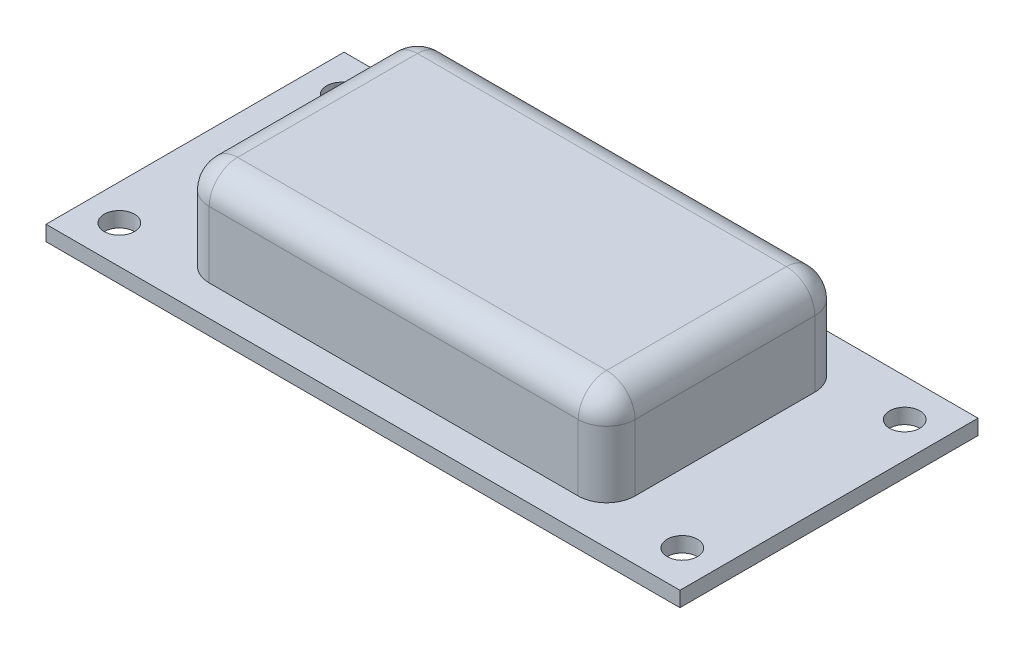
ISO-10303-21;
HEADER;
FILE_DESCRIPTION(('STEP AP214'),'2;1');
FILE_NAME('part.step','',(''),(''),'','','');
FILE_SCHEMA(('AUTOMOTIVE_DESIGN { 1 0 10303 214 1 1 1 1 }'));
ENDSEC;
DATA;
#1=APPLICATION_CONTEXT('core data for automotive mechanical design processes');
#2=APPLICATION_PROTOCOL_DEFINITION('international standard','automotive_design',2000,#1);
#3=PRODUCT_CONTEXT('',#1,'mechanical');
#4=PRODUCT('Part','Part','',(#3));
#5=PRODUCT_RELATED_PRODUCT_CATEGORY('part','',(#4));
#6=PRODUCT_DEFINITION_FORMATION('','',#4);
#7=PRODUCT_DEFINITION_CONTEXT('part definition',#1,'design');
#8=PRODUCT_DEFINITION('design','',#6,#7);
#9=PRODUCT_DEFINITION_SHAPE('','',#8);
#10=(LENGTH_UNIT() NAMED_UNIT(*) SI_UNIT(.MILLI.,.METRE.));
#11=(NAMED_UNIT(*) PLANE_ANGLE_UNIT() SI_UNIT($,.RADIAN.));
#12=(NAMED_UNIT(*) SI_UNIT($,.STERADIAN.) SOLID_ANGLE_UNIT());
#13=UNCERTAINTY_MEASURE_WITH_UNIT(LENGTH_MEASURE(1.E-05),#10,'distance_accuracy_value','');
#14=(GEOMETRIC_REPRESENTATION_CONTEXT(3) GLOBAL_UNCERTAINTY_ASSIGNED_CONTEXT((#13)) GLOBAL_UNIT_ASSIGNED_CONTEXT((#10,
#11,#12)) REPRESENTATION_CONTEXT('',''));
#15=CARTESIAN_POINT('',(0.,0.,0.));
#16=DIRECTION('',(0.,0.,1.));
#17=DIRECTION('',(1.,0.,0.));
#18=AXIS2_PLACEMENT_3D('',#15,#16,#17);
#19=CARTESIAN_POINT('',(0.,1.6,0.));
#20=DIRECTION('',(0.,-1.,0.));
#21=DIRECTION('',(0.,0.,-1.));
#22=AXIS2_PLACEMENT_3D('',#19,#20,#21);
#23=PLANE('',#22);
#24=CARTESIAN_POINT('',(29.75,1.6,-11.75));
#25=DIRECTION('',(0.,1.,0.));
#26=DIRECTION('',(0.,0.,1.));
#27=AXIS2_PLACEMENT_3D('',#24,#25,#26);
#28=CIRCLE('',#27,1.6);
#29=CARTESIAN_POINT('',(29.75,1.6,-10.15));
#30=VERTEX_POINT('',#29);
#31=EDGE_CURVE('E270',#30,#30,#28,.T.);
#32=ORIENTED_EDGE('',*,*,#31,.F.);
#33=EDGE_LOOP('',(#32));
#34=FACE_BOUND('',#33,.T.);
#35=CARTESIAN_POINT('',(29.75,1.6,11.75));
#36=DIRECTION('',(0.,1.,0.));
#37=DIRECTION('',(0.,0.,1.));
#38=AXIS2_PLACEMENT_3D('',#35,#36,#37);
#39=CIRCLE('',#38,1.6);
#40=CARTESIAN_POINT('',(29.75,1.6,13.35));
#41=VERTEX_POINT('',#40);
#42=EDGE_CURVE('E278',#41,#41,#39,.T.);
#43=ORIENTED_EDGE('',*,*,#42,.F.);
#44=EDGE_LOOP('',(#43));
#45=FACE_BOUND('',#44,.T.);
#46=CARTESIAN_POINT('',(-29.75,1.6,11.75));
#47=DIRECTION('',(0.,1.,0.));
#48=DIRECTION('',(0.,0.,1.));
#49=AXIS2_PLACEMENT_3D('',#46,#47,#48);
#50=CIRCLE('',#49,1.6);
#51=CARTESIAN_POINT('',(-29.75,1.6,13.35));
#52=VERTEX_POINT('',#51);
#53=EDGE_CURVE('E286',#52,#52,#50,.T.);
#54=ORIENTED_EDGE('',*,*,#53,.F.);
#55=EDGE_LOOP('',(#54));
#56=FACE_BOUND('',#55,.T.);
#57=CARTESIAN_POINT('',(-29.75,1.6,-11.75));
#58=DIRECTION('',(0.,1.,0.));
#59=DIRECTION('',(0.,0.,1.));
#60=AXIS2_PLACEMENT_3D('',#57,#58,#59);
#61=CIRCLE('',#60,1.6);
#62=CARTESIAN_POINT('',(-29.75,1.6,-10.15));
#63=VERTEX_POINT('',#62);
#64=EDGE_CURVE('E294',#63,#63,#61,.T.);
#65=ORIENTED_EDGE('',*,*,#64,.F.);
#66=EDGE_LOOP('',(#65));
#67=FACE_BOUND('',#66,.T.);
#68=DIRECTION('',(0.,0.,-1.));
#69=VECTOR('',#68,1.);
#70=CARTESIAN_POINT('',(33.5,1.6,15.75));
#71=LINE('',#70,#69);
#72=CARTESIAN_POINT('',(33.5,1.6,15.75));
#73=VERTEX_POINT('',#72);
#74=CARTESIAN_POINT('',(33.5,1.6,-15.75));
#75=VERTEX_POINT('',#74);
#76=EDGE_CURVE('E155',#73,#75,#71,.T.);
#77=ORIENTED_EDGE('',*,*,#76,.T.);
#78=DIRECTION('',(-1.,0.,0.));
#79=VECTOR('',#78,1.);
#80=CARTESIAN_POINT('',(-33.5,1.6,-15.75));
#81=LINE('',#80,#79);
#82=CARTESIAN_POINT('',(-33.5,1.6,-15.75));
#83=VERTEX_POINT('',#82);
#84=EDGE_CURVE('E143',#75,#83,#81,.T.);
#85=ORIENTED_EDGE('',*,*,#84,.T.);
#86=DIRECTION('',(0.,0.,1.));
#87=VECTOR('',#86,1.);
#88=CARTESIAN_POINT('',(-33.5,1.6,15.75));
#89=LINE('',#88,#87);
#90=CARTESIAN_POINT('',(-33.5,1.6,15.75));
#91=VERTEX_POINT('',#90);
#92=EDGE_CURVE('E154',#83,#91,#89,.T.);
#93=ORIENTED_EDGE('',*,*,#92,.T.);
#94=DIRECTION('',(1.,0.,0.));
#95=VECTOR('',#94,1.);
#96=CARTESIAN_POINT('',(-33.5,1.6,15.75));
#97=LINE('',#96,#95);
#98=EDGE_CURVE('E160',#91,#73,#97,.T.);
#99=ORIENTED_EDGE('',*,*,#98,.T.);
#100=EDGE_LOOP('',(#77,#85,#93,#99));
#101=FACE_BOUND('',#100,.T.);
#102=DIRECTION('',(0.,0.,-1.));
#103=VECTOR('',#102,1.);
#104=CARTESIAN_POINT('',(22.5,1.6,12.5));
#105=LINE('',#104,#103);
#106=CARTESIAN_POINT('',(22.5,1.6,9.5));
#107=VERTEX_POINT('',#106);
#108=CARTESIAN_POINT('',(22.5,1.6,-9.5));
#109=VERTEX_POINT('',#108);
#110=EDGE_CURVE('E246',#107,#109,#105,.T.);
#111=ORIENTED_EDGE('',*,*,#110,.F.);
#112=CARTESIAN_POINT('',(19.5,1.6,9.5));
#113=DIRECTION('',(0.,-1.,0.));
#114=DIRECTION('',(0.,0.,-1.));
#115=AXIS2_PLACEMENT_3D('',#112,#113,#114);
#116=CIRCLE('',#115,3.);
#117=CARTESIAN_POINT('',(19.5,1.6,12.5));
#118=VERTEX_POINT('',#117);
#119=EDGE_CURVE('E211',#107,#118,#116,.T.);
#120=ORIENTED_EDGE('',*,*,#119,.T.);
#121=DIRECTION('',(1.,0.,0.));
#122=VECTOR('',#121,1.);
#123=CARTESIAN_POINT('',(-22.5,1.6,12.5));
#124=LINE('',#123,#122);
#125=CARTESIAN_POINT('',(-19.5,1.6,12.5));
#126=VERTEX_POINT('',#125);
#127=EDGE_CURVE('E265',#126,#118,#124,.T.);
#128=ORIENTED_EDGE('',*,*,#127,.F.);
#129=CARTESIAN_POINT('',(-19.5,1.6,9.5));
#130=DIRECTION('',(0.,-1.,0.));
#131=DIRECTION('',(0.,0.,-1.));
#132=AXIS2_PLACEMENT_3D('',#129,#130,#131);
#133=CIRCLE('',#132,3.);
#134=CARTESIAN_POINT('',(-22.5,1.6,9.5));
#135=VERTEX_POINT('',#134);
#136=EDGE_CURVE('E209',#126,#135,#133,.T.);
#137=ORIENTED_EDGE('',*,*,#136,.T.);
#138=DIRECTION('',(0.,0.,1.));
#139=VECTOR('',#138,1.);
#140=CARTESIAN_POINT('',(-22.5,1.6,12.5));
#141=LINE('',#140,#139);
#142=CARTESIAN_POINT('',(-22.5,1.6,-9.5));
#143=VERTEX_POINT('',#142);
#144=EDGE_CURVE('E260',#143,#135,#141,.T.);
#145=ORIENTED_EDGE('',*,*,#144,.F.);
#146=CARTESIAN_POINT('',(-19.5,1.6,-9.5));
#147=DIRECTION('',(0.,-1.,0.));
#148=DIRECTION('',(0.,0.,-1.));
#149=AXIS2_PLACEMENT_3D('',#146,#147,#148);
#150=CIRCLE('',#149,3.);
#151=CARTESIAN_POINT('',(-19.5,1.6,-12.5));
#152=VERTEX_POINT('',#151);
#153=EDGE_CURVE('E11',#143,#152,#150,.T.);
#154=ORIENTED_EDGE('',*,*,#153,.T.);
#155=DIRECTION('',(-1.,0.,0.));
#156=VECTOR('',#155,1.);
#157=CARTESIAN_POINT('',(-22.5,1.6,-12.5));
#158=LINE('',#157,#156);
#159=CARTESIAN_POINT('',(19.5,1.6,-12.5));
#160=VERTEX_POINT('',#159);
#161=EDGE_CURVE('E252',#160,#152,#158,.T.);
#162=ORIENTED_EDGE('',*,*,#161,.F.);
#163=CARTESIAN_POINT('',(19.5,1.6,-9.5));
#164=DIRECTION('',(0.,-1.,0.));
#165=DIRECTION('',(0.,0.,-1.));
#166=AXIS2_PLACEMENT_3D('',#163,#164,#165);
#167=CIRCLE('',#166,3.);
#168=EDGE_CURVE('E48',#160,#109,#167,.T.);
#169=ORIENTED_EDGE('',*,*,#168,.T.);
#170=EDGE_LOOP('',(#111,#120,#128,#137,#145,#154,#162,#169));
#171=FACE_BOUND('',#170,.T.);
#172=ADVANCED_FACE('F39',(#34,#45,#56,#67,#101,#171),#23,.F.);
#173=CARTESIAN_POINT('',(0.,0.,0.));
#174=DIRECTION('',(0.,-1.,0.));
#175=DIRECTION('',(0.,0.,-1.));
#176=AXIS2_PLACEMENT_3D('',#173,#174,#175);
#177=PLANE('',#176);
#178=CARTESIAN_POINT('',(29.75,0.,11.75));
#179=DIRECTION('',(0.,1.,0.));
#180=DIRECTION('',(0.,0.,1.));
#181=AXIS2_PLACEMENT_3D('',#178,#179,#180);
#182=CIRCLE('',#181,1.6);
#183=CARTESIAN_POINT('',(29.75,0.,13.35));
#184=VERTEX_POINT('',#183);
#185=EDGE_CURVE('E274',#184,#184,#182,.T.);
#186=ORIENTED_EDGE('',*,*,#185,.T.);
#187=EDGE_LOOP('',(#186));
#188=FACE_BOUND('',#187,.T.);
#189=CARTESIAN_POINT('',(-29.75,0.,-11.75));
#190=DIRECTION('',(0.,1.,0.));
#191=DIRECTION('',(0.,0.,1.));
#192=AXIS2_PLACEMENT_3D('',#189,#190,#191);
#193=CIRCLE('',#192,1.6);
#194=CARTESIAN_POINT('',(-29.75,0.,-10.15));
#195=VERTEX_POINT('',#194);
#196=EDGE_CURVE('E290',#195,#195,#193,.T.);
#197=ORIENTED_EDGE('',*,*,#196,.T.);
#198=EDGE_LOOP('',(#197));
#199=FACE_BOUND('',#198,.T.);
#200=DIRECTION('',(0.,0.,-1.));
#201=VECTOR('',#200,1.);
#202=CARTESIAN_POINT('',(33.5,0.,15.75));
#203=LINE('',#202,#201);
#204=CARTESIAN_POINT('',(33.5,0.,15.75));
#205=VERTEX_POINT('',#204);
#206=CARTESIAN_POINT('',(33.5,0.,-15.75));
#207=VERTEX_POINT('',#206);
#208=EDGE_CURVE('E169',#205,#207,#203,.T.);
#209=ORIENTED_EDGE('',*,*,#208,.F.);
#210=DIRECTION('',(1.,0.,0.));
#211=VECTOR('',#210,1.);
#212=CARTESIAN_POINT('',(-33.5,0.,15.75));
#213=LINE('',#212,#211);
#214=CARTESIAN_POINT('',(-33.5,0.,15.75));
#215=VERTEX_POINT('',#214);
#216=EDGE_CURVE('E165',#215,#205,#213,.T.);
#217=ORIENTED_EDGE('',*,*,#216,.F.);
#218=DIRECTION('',(0.,0.,1.));
#219=VECTOR('',#218,1.);
#220=CARTESIAN_POINT('',(-33.5,0.,15.75));
#221=LINE('',#220,#219);
#222=CARTESIAN_POINT('',(-33.5,0.,-15.75));
#223=VERTEX_POINT('',#222);
#224=EDGE_CURVE('E310',#223,#215,#221,.T.);
#225=ORIENTED_EDGE('',*,*,#224,.F.);
#226=DIRECTION('',(-1.,0.,0.));
#227=VECTOR('',#226,1.);
#228=CARTESIAN_POINT('',(-33.5,0.,-15.75));
#229=LINE('',#228,#227);
#230=EDGE_CURVE('E307',#207,#223,#229,.T.);
#231=ORIENTED_EDGE('',*,*,#230,.F.);
#232=EDGE_LOOP('',(#209,#217,#225,#231));
#233=FACE_BOUND('',#232,.T.);
#234=CARTESIAN_POINT('',(-29.75,0.,11.75));
#235=DIRECTION('',(0.,1.,0.));
#236=DIRECTION('',(0.,0.,1.));
#237=AXIS2_PLACEMENT_3D('',#234,#235,#236);
#238=CIRCLE('',#237,1.6);
#239=CARTESIAN_POINT('',(-29.75,0.,13.35));
#240=VERTEX_POINT('',#239);
#241=EDGE_CURVE('E282',#240,#240,#238,.T.);
#242=ORIENTED_EDGE('',*,*,#241,.T.);
#243=EDGE_LOOP('',(#242));
#244=FACE_BOUND('',#243,.T.);
#245=CARTESIAN_POINT('',(29.75,0.,-11.75));
#246=DIRECTION('',(0.,1.,0.));
#247=DIRECTION('',(0.,0.,1.));
#248=AXIS2_PLACEMENT_3D('',#245,#246,#247);
#249=CIRCLE('',#248,1.6);
#250=CARTESIAN_POINT('',(29.75,0.,-10.15));
#251=VERTEX_POINT('',#250);
#252=EDGE_CURVE('E269',#251,#251,#249,.T.);
#253=ORIENTED_EDGE('',*,*,#252,.T.);
#254=EDGE_LOOP('',(#253));
#255=FACE_BOUND('',#254,.T.);
#256=ADVANCED_FACE('F325',(#188,#199,#233,#244,#255),#177,.T.);
#257=CARTESIAN_POINT('',(33.5,1.6,15.75));
#258=DIRECTION('',(-1.,0.,0.));
#259=DIRECTION('',(0.,0.,1.));
#260=AXIS2_PLACEMENT_3D('',#257,#258,#259);
#261=PLANE('',#260);
#262=ORIENTED_EDGE('',*,*,#208,.T.);
#263=DIRECTION('',(0.,-1.,0.));
#264=VECTOR('',#263,1.);
#265=CARTESIAN_POINT('',(33.5,1.6,-15.75));
#266=LINE('',#265,#264);
#267=EDGE_CURVE('E147',#75,#207,#266,.T.);
#268=ORIENTED_EDGE('',*,*,#267,.F.);
#269=ORIENTED_EDGE('',*,*,#76,.F.);
#270=DIRECTION('',(0.,-1.,0.));
#271=VECTOR('',#270,1.);
#272=CARTESIAN_POINT('',(33.5,1.6,15.75));
#273=LINE('',#272,#271);
#274=EDGE_CURVE('E304',#73,#205,#273,.T.);
#275=ORIENTED_EDGE('',*,*,#274,.T.);
#276=EDGE_LOOP('',(#262,#268,#269,#275));
#277=FACE_BOUND('',#276,.T.);
#278=ADVANCED_FACE('F167',(#277),#261,.F.);
#279=CARTESIAN_POINT('',(-33.5,1.6,-15.75));
#280=DIRECTION('',(0.,0.,1.));
#281=DIRECTION('',(1.,0.,0.));
#282=AXIS2_PLACEMENT_3D('',#279,#280,#281);
#283=PLANE('',#282);
#284=ORIENTED_EDGE('',*,*,#230,.T.);
#285=DIRECTION('',(0.,-1.,0.));
#286=VECTOR('',#285,1.);
#287=CARTESIAN_POINT('',(-33.5,1.6,-15.75));
#288=LINE('',#287,#286);
#289=EDGE_CURVE('E150',#83,#223,#288,.T.);
#290=ORIENTED_EDGE('',*,*,#289,.F.);
#291=ORIENTED_EDGE('',*,*,#84,.F.);
#292=ORIENTED_EDGE('',*,*,#267,.T.);
#293=EDGE_LOOP('',(#284,#290,#291,#292));
#294=FACE_BOUND('',#293,.T.);
#295=ADVANCED_FACE('F145',(#294),#283,.F.);
#296=CARTESIAN_POINT('',(-33.5,1.6,15.75));
#297=DIRECTION('',(1.,0.,0.));
#298=DIRECTION('',(0.,0.,-1.));
#299=AXIS2_PLACEMENT_3D('',#296,#297,#298);
#300=PLANE('',#299);
#301=ORIENTED_EDGE('',*,*,#224,.T.);
#302=DIRECTION('',(0.,-1.,0.));
#303=VECTOR('',#302,1.);
#304=CARTESIAN_POINT('',(-33.5,1.6,15.75));
#305=LINE('',#304,#303);
#306=EDGE_CURVE('E177',#91,#215,#305,.T.);
#307=ORIENTED_EDGE('',*,*,#306,.F.);
#308=ORIENTED_EDGE('',*,*,#92,.F.);
#309=ORIENTED_EDGE('',*,*,#289,.T.);
#310=EDGE_LOOP('',(#301,#307,#308,#309));
#311=FACE_BOUND('',#310,.T.);
#312=ADVANCED_FACE('F327',(#311),#300,.F.);
#313=CARTESIAN_POINT('',(-33.5,1.6,15.75));
#314=DIRECTION('',(0.,0.,-1.));
#315=DIRECTION('',(-1.,0.,0.));
#316=AXIS2_PLACEMENT_3D('',#313,#314,#315);
#317=PLANE('',#316);
#318=ORIENTED_EDGE('',*,*,#216,.T.);
#319=ORIENTED_EDGE('',*,*,#274,.F.);
#320=ORIENTED_EDGE('',*,*,#98,.F.);
#321=ORIENTED_EDGE('',*,*,#306,.T.);
#322=EDGE_LOOP('',(#318,#319,#320,#321));
#323=FACE_BOUND('',#322,.T.);
#324=ADVANCED_FACE('F321',(#323),#317,.F.);
#325=CARTESIAN_POINT('',(-29.75,1.6,-11.75));
#326=DIRECTION('',(0.,-1.,0.));
#327=DIRECTION('',(0.,0.,-1.));
#328=AXIS2_PLACEMENT_3D('',#325,#326,#327);
#329=CYLINDRICAL_SURFACE('',#328,1.6);
#330=ORIENTED_EDGE('',*,*,#64,.T.);
#331=EDGE_LOOP('',(#330));
#332=FACE_BOUND('',#331,.T.);
#333=ORIENTED_EDGE('',*,*,#196,.F.);
#334=EDGE_LOOP('',(#333));
#335=FACE_BOUND('',#334,.T.);
#336=ADVANCED_FACE('F334',(#332,#335),#329,.F.);
#337=CARTESIAN_POINT('',(-29.75,1.6,11.75));
#338=DIRECTION('',(0.,-1.,0.));
#339=DIRECTION('',(0.,0.,-1.));
#340=AXIS2_PLACEMENT_3D('',#337,#338,#339);
#341=CYLINDRICAL_SURFACE('',#340,1.6);
#342=ORIENTED_EDGE('',*,*,#53,.T.);
#343=EDGE_LOOP('',(#342));
#344=FACE_BOUND('',#343,.T.);
#345=ORIENTED_EDGE('',*,*,#241,.F.);
#346=EDGE_LOOP('',(#345));
#347=FACE_BOUND('',#346,.T.);
#348=ADVANCED_FACE('F352',(#344,#347),#341,.F.);
#349=CARTESIAN_POINT('',(29.75,1.6,11.75));
#350=DIRECTION('',(0.,-1.,0.));
#351=DIRECTION('',(0.,0.,-1.));
#352=AXIS2_PLACEMENT_3D('',#349,#350,#351);
#353=CYLINDRICAL_SURFACE('',#352,1.6);
#354=ORIENTED_EDGE('',*,*,#42,.T.);
#355=EDGE_LOOP('',(#354));
#356=FACE_BOUND('',#355,.T.);
#357=ORIENTED_EDGE('',*,*,#185,.F.);
#358=EDGE_LOOP('',(#357));
#359=FACE_BOUND('',#358,.T.);
#360=ADVANCED_FACE('F356',(#356,#359),#353,.F.);
#361=CARTESIAN_POINT('',(29.75,1.6,-11.75));
#362=DIRECTION('',(0.,-1.,0.));
#363=DIRECTION('',(0.,0.,-1.));
#364=AXIS2_PLACEMENT_3D('',#361,#362,#363);
#365=CYLINDRICAL_SURFACE('',#364,1.6);
#366=ORIENTED_EDGE('',*,*,#31,.T.);
#367=EDGE_LOOP('',(#366));
#368=FACE_BOUND('',#367,.T.);
#369=ORIENTED_EDGE('',*,*,#252,.F.);
#370=EDGE_LOOP('',(#369));
#371=FACE_BOUND('',#370,.T.);
#372=ADVANCED_FACE('F360',(#368,#371),#365,.F.);
#373=CARTESIAN_POINT('',(22.5,11.6,12.5));
#374=DIRECTION('',(-1.,0.,0.));
#375=DIRECTION('',(0.,0.,1.));
#376=AXIS2_PLACEMENT_3D('',#373,#374,#375);
#377=PLANE('',#376);
#378=DIRECTION('',(0.,0.,-1.));
#379=VECTOR('',#378,1.);
#380=CARTESIAN_POINT('',(22.5,8.6,12.5));
#381=LINE('',#380,#379);
#382=CARTESIAN_POINT('',(22.5,8.6,-9.5));
#383=VERTEX_POINT('',#382);
#384=CARTESIAN_POINT('',(22.5,8.6,9.5));
#385=VERTEX_POINT('',#384);
#386=EDGE_CURVE('E191',#383,#385,#381,.F.);
#387=ORIENTED_EDGE('',*,*,#386,.T.);
#388=DIRECTION('',(0.,-1.,0.));
#389=VECTOR('',#388,1.);
#390=CARTESIAN_POINT('',(22.5,11.6,9.5));
#391=LINE('',#390,#389);
#392=EDGE_CURVE('E195',#385,#107,#391,.T.);
#393=ORIENTED_EDGE('',*,*,#392,.T.);
#394=ORIENTED_EDGE('',*,*,#110,.T.);
#395=DIRECTION('',(0.,-1.,0.));
#396=VECTOR('',#395,1.);
#397=CARTESIAN_POINT('',(22.5,11.6,-9.5));
#398=LINE('',#397,#396);
#399=EDGE_CURVE('E193',#109,#383,#398,.F.);
#400=ORIENTED_EDGE('',*,*,#399,.T.);
#401=EDGE_LOOP('',(#387,#393,#394,#400));
#402=FACE_BOUND('',#401,.T.);
#403=ADVANCED_FACE('F364',(#402),#377,.F.);
#404=CARTESIAN_POINT('',(-22.5,11.6,-12.5));
#405=DIRECTION('',(0.,0.,1.));
#406=DIRECTION('',(1.,0.,0.));
#407=AXIS2_PLACEMENT_3D('',#404,#405,#406);
#408=PLANE('',#407);
#409=DIRECTION('',(-1.,0.,0.));
#410=VECTOR('',#409,1.);
#411=CARTESIAN_POINT('',(-22.5,8.6,-12.5));
#412=LINE('',#411,#410);
#413=CARTESIAN_POINT('',(-19.5,8.6,-12.5));
#414=VERTEX_POINT('',#413);
#415=CARTESIAN_POINT('',(19.5,8.6,-12.5));
#416=VERTEX_POINT('',#415);
#417=EDGE_CURVE('E197',#414,#416,#412,.F.);
#418=ORIENTED_EDGE('',*,*,#417,.T.);
#419=DIRECTION('',(0.,-1.,0.));
#420=VECTOR('',#419,1.);
#421=CARTESIAN_POINT('',(19.5,11.6,-12.5));
#422=LINE('',#421,#420);
#423=EDGE_CURVE('E201',#416,#160,#422,.T.);
#424=ORIENTED_EDGE('',*,*,#423,.T.);
#425=ORIENTED_EDGE('',*,*,#161,.T.);
#426=DIRECTION('',(0.,-1.,0.));
#427=VECTOR('',#426,1.);
#428=CARTESIAN_POINT('',(-19.5,11.6,-12.5));
#429=LINE('',#428,#427);
#430=EDGE_CURVE('E199',#152,#414,#429,.F.);
#431=ORIENTED_EDGE('',*,*,#430,.T.);
#432=EDGE_LOOP('',(#418,#424,#425,#431));
#433=FACE_BOUND('',#432,.T.);
#434=ADVANCED_FACE('F368',(#433),#408,.F.);
#435=CARTESIAN_POINT('',(-22.5,11.6,12.5));
#436=DIRECTION('',(1.,0.,0.));
#437=DIRECTION('',(0.,0.,-1.));
#438=AXIS2_PLACEMENT_3D('',#435,#436,#437);
#439=PLANE('',#438);
#440=ORIENTED_EDGE('',*,*,#144,.T.);
#441=DIRECTION('',(0.,-1.,0.));
#442=VECTOR('',#441,1.);
#443=CARTESIAN_POINT('',(-22.5,11.6,9.5));
#444=LINE('',#443,#442);
#445=CARTESIAN_POINT('',(-22.5,8.6,9.5));
#446=VERTEX_POINT('',#445);
#447=EDGE_CURVE('E189',#135,#446,#444,.F.);
#448=ORIENTED_EDGE('',*,*,#447,.T.);
#449=DIRECTION('',(0.,0.,1.));
#450=VECTOR('',#449,1.);
#451=CARTESIAN_POINT('',(-22.5,8.6,12.5));
#452=LINE('',#451,#450);
#453=CARTESIAN_POINT('',(-22.5,8.6,-9.5));
#454=VERTEX_POINT('',#453);
#455=EDGE_CURVE('E185',#446,#454,#452,.F.);
#456=ORIENTED_EDGE('',*,*,#455,.T.);
#457=DIRECTION('',(0.,-1.,0.));
#458=VECTOR('',#457,1.);
#459=CARTESIAN_POINT('',(-22.5,11.6,-9.5));
#460=LINE('',#459,#458);
#461=EDGE_CURVE('E187',#454,#143,#460,.T.);
#462=ORIENTED_EDGE('',*,*,#461,.T.);
#463=EDGE_LOOP('',(#440,#448,#456,#462));
#464=FACE_BOUND('',#463,.T.);
#465=ADVANCED_FACE('F371',(#464),#439,.F.);
#466=CARTESIAN_POINT('',(-22.5,11.6,12.5));
#467=DIRECTION('',(0.,0.,-1.));
#468=DIRECTION('',(-1.,0.,0.));
#469=AXIS2_PLACEMENT_3D('',#466,#467,#468);
#470=PLANE('',#469);
#471=DIRECTION('',(1.,0.,0.));
#472=VECTOR('',#471,1.);
#473=CARTESIAN_POINT('',(-22.5,8.6,12.5));
#474=LINE('',#473,#472);
#475=CARTESIAN_POINT('',(19.5,8.6,12.5));
#476=VERTEX_POINT('',#475);
#477=CARTESIAN_POINT('',(-19.5,8.6,12.5));
#478=VERTEX_POINT('',#477);
#479=EDGE_CURVE('E171',#476,#478,#474,.F.);
#480=ORIENTED_EDGE('',*,*,#479,.T.);
#481=DIRECTION('',(0.,-1.,0.));
#482=VECTOR('',#481,1.);
#483=CARTESIAN_POINT('',(-19.5,11.6,12.5));
#484=LINE('',#483,#482);
#485=EDGE_CURVE('E182',#478,#126,#484,.T.);
#486=ORIENTED_EDGE('',*,*,#485,.T.);
#487=ORIENTED_EDGE('',*,*,#127,.T.);
#488=DIRECTION('',(0.,-1.,0.));
#489=VECTOR('',#488,1.);
#490=CARTESIAN_POINT('',(19.5,11.6,12.5));
#491=LINE('',#490,#489);
#492=EDGE_CURVE('E174',#118,#476,#491,.F.);
#493=ORIENTED_EDGE('',*,*,#492,.T.);
#494=EDGE_LOOP('',(#480,#486,#487,#493));
#495=FACE_BOUND('',#494,.T.);
#496=ADVANCED_FACE('F375',(#495),#470,.F.);
#497=CARTESIAN_POINT('',(0.,11.6,0.));
#498=DIRECTION('',(0.,-1.,0.));
#499=DIRECTION('',(0.,0.,-1.));
#500=AXIS2_PLACEMENT_3D('',#497,#498,#499);
#501=PLANE('',#500);
#502=DIRECTION('',(1.,0.,0.));
#503=VECTOR('',#502,1.);
#504=CARTESIAN_POINT('',(0.,11.6,9.5));
#505=LINE('',#504,#503);
#506=CARTESIAN_POINT('',(-19.5,11.6,9.5));
#507=VERTEX_POINT('',#506);
#508=CARTESIAN_POINT('',(19.5,11.6,9.5));
#509=VERTEX_POINT('',#508);
#510=EDGE_CURVE('E64',#507,#509,#505,.T.);
#511=ORIENTED_EDGE('',*,*,#510,.T.);
#512=DIRECTION('',(0.,0.,-1.));
#513=VECTOR('',#512,1.);
#514=CARTESIAN_POINT('',(19.5,11.6,0.));
#515=LINE('',#514,#513);
#516=CARTESIAN_POINT('',(19.5,11.6,-9.5));
#517=VERTEX_POINT('',#516);
#518=EDGE_CURVE('E207',#509,#517,#515,.T.);
#519=ORIENTED_EDGE('',*,*,#518,.T.);
#520=DIRECTION('',(-1.,0.,0.));
#521=VECTOR('',#520,1.);
#522=CARTESIAN_POINT('',(0.,11.6,-9.5));
#523=LINE('',#522,#521);
#524=CARTESIAN_POINT('',(-19.5,11.6,-9.5));
#525=VERTEX_POINT('',#524);
#526=EDGE_CURVE('E56',#517,#525,#523,.T.);
#527=ORIENTED_EDGE('',*,*,#526,.T.);
#528=DIRECTION('',(0.,0.,1.));
#529=VECTOR('',#528,1.);
#530=CARTESIAN_POINT('',(-19.5,11.6,0.));
#531=LINE('',#530,#529);
#532=EDGE_CURVE('E203',#525,#507,#531,.T.);
#533=ORIENTED_EDGE('',*,*,#532,.T.);
#534=EDGE_LOOP('',(#511,#519,#527,#533));
#535=FACE_BOUND('',#534,.T.);
#536=ADVANCED_FACE('F379',(#535),#501,.F.);
#537=CARTESIAN_POINT('',(19.5,11.6,-9.5));
#538=DIRECTION('',(0.,-1.,0.));
#539=DIRECTION('',(0.,0.,-1.));
#540=AXIS2_PLACEMENT_3D('',#537,#538,#539);
#541=CYLINDRICAL_SURFACE('',#540,3.);
#542=CARTESIAN_POINT('',(19.5,8.6,-9.5));
#543=DIRECTION('',(0.,1.,0.));
#544=DIRECTION('',(0.,0.,1.));
#545=AXIS2_PLACEMENT_3D('',#542,#543,#544);
#546=CIRCLE('',#545,3.);
#547=EDGE_CURVE('E43',#383,#416,#546,.T.);
#548=ORIENTED_EDGE('',*,*,#547,.F.);
#549=ORIENTED_EDGE('',*,*,#399,.F.);
#550=ORIENTED_EDGE('',*,*,#168,.F.);
#551=ORIENTED_EDGE('',*,*,#423,.F.);
#552=EDGE_LOOP('',(#548,#549,#550,#551));
#553=FACE_BOUND('',#552,.T.);
#554=ADVANCED_FACE('F41',(#553),#541,.T.);
#555=CARTESIAN_POINT('',(19.5,8.6,-9.5));
#556=DIRECTION('',(0.,0.,1.));
#557=DIRECTION('',(1.,0.,0.));
#558=AXIS2_PLACEMENT_3D('',#555,#556,#557);
#559=SPHERICAL_SURFACE('',#558,3.);
#560=CARTESIAN_POINT('',(19.5,8.6,-9.5));
#561=DIRECTION('',(0.,0.,-1.));
#562=DIRECTION('',(-1.,0.,0.));
#563=AXIS2_PLACEMENT_3D('',#560,#561,#562);
#564=CIRCLE('',#563,3.);
#565=EDGE_CURVE('E241',#383,#517,#564,.F.);
#566=ORIENTED_EDGE('',*,*,#565,.F.);
#567=ORIENTED_EDGE('',*,*,#547,.T.);
#568=CARTESIAN_POINT('',(19.5,8.6,-9.5));
#569=DIRECTION('',(1.,0.,0.));
#570=DIRECTION('',(0.,1.,0.));
#571=AXIS2_PLACEMENT_3D('',#568,#569,#570);
#572=CIRCLE('',#571,3.);
#573=EDGE_CURVE('E243',#517,#416,#572,.F.);
#574=ORIENTED_EDGE('',*,*,#573,.F.);
#575=EDGE_LOOP('',(#566,#567,#574));
#576=FACE_BOUND('',#575,.T.);
#577=ADVANCED_FACE('F385',(#576),#559,.T.);
#578=CARTESIAN_POINT('',(-19.5,11.6,-9.5));
#579=DIRECTION('',(0.,-1.,0.));
#580=DIRECTION('',(0.,0.,-1.));
#581=AXIS2_PLACEMENT_3D('',#578,#579,#580);
#582=CYLINDRICAL_SURFACE('',#581,3.);
#583=ORIENTED_EDGE('',*,*,#153,.F.);
#584=ORIENTED_EDGE('',*,*,#461,.F.);
#585=CARTESIAN_POINT('',(-19.5,8.6,-9.5));
#586=DIRECTION('',(0.,1.,0.));
#587=DIRECTION('',(0.,0.,1.));
#588=AXIS2_PLACEMENT_3D('',#585,#586,#587);
#589=CIRCLE('',#588,3.);
#590=EDGE_CURVE('E238',#414,#454,#589,.T.);
#591=ORIENTED_EDGE('',*,*,#590,.F.);
#592=ORIENTED_EDGE('',*,*,#430,.F.);
#593=EDGE_LOOP('',(#583,#584,#591,#592));
#594=FACE_BOUND('',#593,.T.);
#595=ADVANCED_FACE('F391',(#594),#582,.T.);
#596=CARTESIAN_POINT('',(0.,8.6,-9.5));
#597=DIRECTION('',(-1.,0.,0.));
#598=DIRECTION('',(0.,0.,1.));
#599=AXIS2_PLACEMENT_3D('',#596,#597,#598);
#600=CYLINDRICAL_SURFACE('',#599,3.);
#601=ORIENTED_EDGE('',*,*,#573,.T.);
#602=ORIENTED_EDGE('',*,*,#417,.F.);
#603=CARTESIAN_POINT('',(-19.5,8.6,-9.5));
#604=DIRECTION('',(-1.,0.,0.));
#605=DIRECTION('',(0.,0.,1.));
#606=AXIS2_PLACEMENT_3D('',#603,#604,#605);
#607=CIRCLE('',#606,3.);
#608=EDGE_CURVE('E235',#525,#414,#607,.T.);
#609=ORIENTED_EDGE('',*,*,#608,.F.);
#610=ORIENTED_EDGE('',*,*,#526,.F.);
#611=EDGE_LOOP('',(#601,#602,#609,#610));
#612=FACE_BOUND('',#611,.T.);
#613=ADVANCED_FACE('F445',(#612),#600,.T.);
#614=CARTESIAN_POINT('',(19.5,8.6,0.));
#615=DIRECTION('',(0.,0.,-1.));
#616=DIRECTION('',(-1.,0.,0.));
#617=AXIS2_PLACEMENT_3D('',#614,#615,#616);
#618=CYLINDRICAL_SURFACE('',#617,3.);
#619=ORIENTED_EDGE('',*,*,#565,.T.);
#620=ORIENTED_EDGE('',*,*,#518,.F.);
#621=CARTESIAN_POINT('',(19.5,8.6,9.5));
#622=DIRECTION('',(0.,0.,1.));
#623=DIRECTION('',(1.,0.,0.));
#624=AXIS2_PLACEMENT_3D('',#621,#622,#623);
#625=CIRCLE('',#624,3.);
#626=EDGE_CURVE('E232',#385,#509,#625,.T.);
#627=ORIENTED_EDGE('',*,*,#626,.F.);
#628=ORIENTED_EDGE('',*,*,#386,.F.);
#629=EDGE_LOOP('',(#619,#620,#627,#628));
#630=FACE_BOUND('',#629,.T.);
#631=ADVANCED_FACE('F397',(#630),#618,.T.);
#632=CARTESIAN_POINT('',(19.5,11.6,9.5));
#633=DIRECTION('',(0.,-1.,0.));
#634=DIRECTION('',(0.,0.,-1.));
#635=AXIS2_PLACEMENT_3D('',#632,#633,#634);
#636=CYLINDRICAL_SURFACE('',#635,3.);
#637=ORIENTED_EDGE('',*,*,#119,.F.);
#638=ORIENTED_EDGE('',*,*,#392,.F.);
#639=CARTESIAN_POINT('',(19.5,8.6,9.5));
#640=DIRECTION('',(0.,1.,0.));
#641=DIRECTION('',(0.,0.,1.));
#642=AXIS2_PLACEMENT_3D('',#639,#640,#641);
#643=CIRCLE('',#642,3.);
#644=EDGE_CURVE('E229',#476,#385,#643,.T.);
#645=ORIENTED_EDGE('',*,*,#644,.F.);
#646=ORIENTED_EDGE('',*,*,#492,.F.);
#647=EDGE_LOOP('',(#637,#638,#645,#646));
#648=FACE_BOUND('',#647,.T.);
#649=ADVANCED_FACE('F402',(#648),#636,.T.);
#650=CARTESIAN_POINT('',(-19.5,8.6,-9.5));
#651=DIRECTION('',(0.,0.,1.));
#652=DIRECTION('',(1.,0.,0.));
#653=AXIS2_PLACEMENT_3D('',#650,#651,#652);
#654=SPHERICAL_SURFACE('',#653,3.);
#655=ORIENTED_EDGE('',*,*,#608,.T.);
#656=ORIENTED_EDGE('',*,*,#590,.T.);
#657=CARTESIAN_POINT('',(-19.5,8.6,-9.5));
#658=DIRECTION('',(0.,0.,-1.));
#659=DIRECTION('',(0.,1.,0.));
#660=AXIS2_PLACEMENT_3D('',#657,#658,#659);
#661=CIRCLE('',#660,3.);
#662=EDGE_CURVE('E226',#525,#454,#661,.F.);
#663=ORIENTED_EDGE('',*,*,#662,.F.);
#664=EDGE_LOOP('',(#655,#656,#663));
#665=FACE_BOUND('',#664,.T.);
#666=ADVANCED_FACE('F422',(#665),#654,.T.);
#667=CARTESIAN_POINT('',(19.5,8.6,9.5));
#668=DIRECTION('',(0.,0.,1.));
#669=DIRECTION('',(1.,0.,0.));
#670=AXIS2_PLACEMENT_3D('',#667,#668,#669);
#671=SPHERICAL_SURFACE('',#670,3.);
#672=ORIENTED_EDGE('',*,*,#644,.T.);
#673=ORIENTED_EDGE('',*,*,#626,.T.);
#674=CARTESIAN_POINT('',(19.5,8.6,9.5));
#675=DIRECTION('',(1.,0.,0.));
#676=DIRECTION('',(0.,0.,-1.));
#677=AXIS2_PLACEMENT_3D('',#674,#675,#676);
#678=CIRCLE('',#677,3.);
#679=EDGE_CURVE('E223',#476,#509,#678,.F.);
#680=ORIENTED_EDGE('',*,*,#679,.F.);
#681=EDGE_LOOP('',(#672,#673,#680));
#682=FACE_BOUND('',#681,.T.);
#683=ADVANCED_FACE('F430',(#682),#671,.T.);
#684=CARTESIAN_POINT('',(-19.5,8.6,0.));
#685=DIRECTION('',(0.,0.,1.));
#686=DIRECTION('',(1.,0.,0.));
#687=AXIS2_PLACEMENT_3D('',#684,#685,#686);
#688=CYLINDRICAL_SURFACE('',#687,3.);
#689=ORIENTED_EDGE('',*,*,#662,.T.);
#690=ORIENTED_EDGE('',*,*,#455,.F.);
#691=CARTESIAN_POINT('',(-19.5,8.6,9.5));
#692=DIRECTION('',(0.,0.,1.));
#693=DIRECTION('',(1.,0.,0.));
#694=AXIS2_PLACEMENT_3D('',#691,#692,#693);
#695=CIRCLE('',#694,3.);
#696=EDGE_CURVE('E220',#507,#446,#695,.T.);
#697=ORIENTED_EDGE('',*,*,#696,.F.);
#698=ORIENTED_EDGE('',*,*,#532,.F.);
#699=EDGE_LOOP('',(#689,#690,#697,#698));
#700=FACE_BOUND('',#699,.T.);
#701=ADVANCED_FACE('F425',(#700),#688,.T.);
#702=CARTESIAN_POINT('',(0.,8.6,9.5));
#703=DIRECTION('',(1.,0.,0.));
#704=DIRECTION('',(0.,0.,-1.));
#705=AXIS2_PLACEMENT_3D('',#702,#703,#704);
#706=CYLINDRICAL_SURFACE('',#705,3.);
#707=ORIENTED_EDGE('',*,*,#679,.T.);
#708=ORIENTED_EDGE('',*,*,#510,.F.);
#709=CARTESIAN_POINT('',(-19.5,8.6,9.5));
#710=DIRECTION('',(-1.,0.,0.));
#711=DIRECTION('',(0.,0.,1.));
#712=AXIS2_PLACEMENT_3D('',#709,#710,#711);
#713=CIRCLE('',#712,3.);
#714=EDGE_CURVE('E217',#478,#507,#713,.T.);
#715=ORIENTED_EDGE('',*,*,#714,.F.);
#716=ORIENTED_EDGE('',*,*,#479,.F.);
#717=EDGE_LOOP('',(#707,#708,#715,#716));
#718=FACE_BOUND('',#717,.T.);
#719=ADVANCED_FACE('F428',(#718),#706,.T.);
#720=CARTESIAN_POINT('',(-19.5,8.6,9.5));
#721=DIRECTION('',(0.,0.,1.));
#722=DIRECTION('',(1.,0.,0.));
#723=AXIS2_PLACEMENT_3D('',#720,#721,#722);
#724=SPHERICAL_SURFACE('',#723,3.);
#725=ORIENTED_EDGE('',*,*,#714,.T.);
#726=ORIENTED_EDGE('',*,*,#696,.T.);
#727=CARTESIAN_POINT('',(-19.5,8.6,9.5));
#728=DIRECTION('',(0.,1.,0.));
#729=DIRECTION('',(0.,0.,1.));
#730=AXIS2_PLACEMENT_3D('',#727,#728,#729);
#731=CIRCLE('',#730,3.);
#732=EDGE_CURVE('E214',#478,#446,#731,.F.);
#733=ORIENTED_EDGE('',*,*,#732,.F.);
#734=EDGE_LOOP('',(#725,#726,#733));
#735=FACE_BOUND('',#734,.T.);
#736=ADVANCED_FACE('F480',(#735),#724,.T.);
#737=CARTESIAN_POINT('',(-19.5,11.6,9.5));
#738=DIRECTION('',(0.,-1.,0.));
#739=DIRECTION('',(0.,0.,-1.));
#740=AXIS2_PLACEMENT_3D('',#737,#738,#739);
#741=CYLINDRICAL_SURFACE('',#740,3.);
#742=ORIENTED_EDGE('',*,*,#732,.T.);
#743=ORIENTED_EDGE('',*,*,#447,.F.);
#744=ORIENTED_EDGE('',*,*,#136,.F.);
#745=ORIENTED_EDGE('',*,*,#485,.F.);
#746=EDGE_LOOP('',(#742,#743,#744,#745));
#747=FACE_BOUND('',#746,.T.);
#748=ADVANCED_FACE('F410',(#747),#741,.T.);
#749=CLOSED_SHELL('',(#172,#256,#278,#295,#312,#324,#336,#348,#360,#372,#403,#434,#465,#496,
#536,#554,#577,#595,#613,#631,#649,#666,#683,#701,#719,#736,#748));
#750=MANIFOLD_SOLID_BREP('B2',#749);
#751=ADVANCED_BREP_SHAPE_REPRESENTATION('',(#18,#750),#14);
#752=SHAPE_DEFINITION_REPRESENTATION(#9,#751);
ENDSEC;
END-ISO-10303-21;
